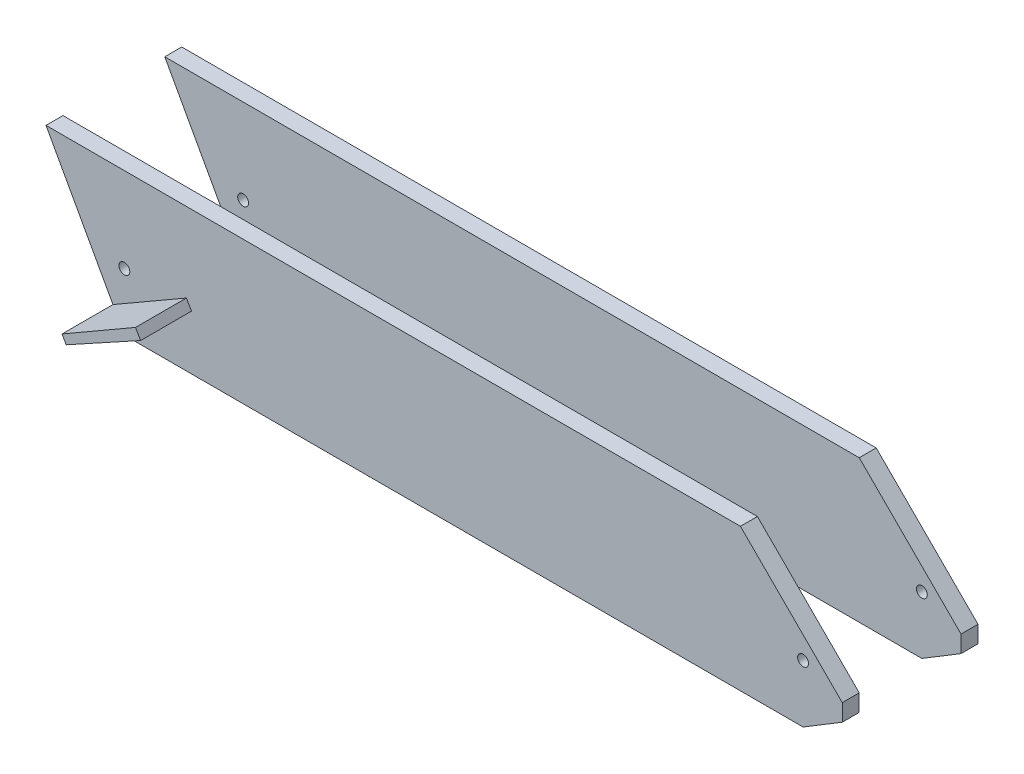
ISO-10303-21;
HEADER;
FILE_DESCRIPTION(('STEP AP214'),'2;1');
FILE_NAME('part.step','',(''),(''),'','','');
FILE_SCHEMA(('AUTOMOTIVE_DESIGN { 1 0 10303 214 1 1 1 1 }'));
ENDSEC;
DATA;
#1=APPLICATION_CONTEXT('core data for automotive mechanical design processes');
#2=APPLICATION_PROTOCOL_DEFINITION('international standard','automotive_design',2000,#1);
#3=PRODUCT_CONTEXT('',#1,'mechanical');
#4=PRODUCT('Part','Part','',(#3));
#5=PRODUCT_RELATED_PRODUCT_CATEGORY('part','',(#4));
#6=PRODUCT_DEFINITION_FORMATION('','',#4);
#7=PRODUCT_DEFINITION_CONTEXT('part definition',#1,'design');
#8=PRODUCT_DEFINITION('design','',#6,#7);
#9=PRODUCT_DEFINITION_SHAPE('','',#8);
#10=(LENGTH_UNIT() NAMED_UNIT(*) SI_UNIT(.MILLI.,.METRE.));
#11=(NAMED_UNIT(*) PLANE_ANGLE_UNIT() SI_UNIT($,.RADIAN.));
#12=(NAMED_UNIT(*) SI_UNIT($,.STERADIAN.) SOLID_ANGLE_UNIT());
#13=UNCERTAINTY_MEASURE_WITH_UNIT(LENGTH_MEASURE(1.E-05),#10,'distance_accuracy_value','');
#14=(GEOMETRIC_REPRESENTATION_CONTEXT(3) GLOBAL_UNCERTAINTY_ASSIGNED_CONTEXT((#13)) GLOBAL_UNIT_ASSIGNED_CONTEXT((#10,
#11,#12)) REPRESENTATION_CONTEXT('',''));
#15=CARTESIAN_POINT('',(0.,0.,0.));
#16=DIRECTION('',(0.,0.,1.));
#17=DIRECTION('',(1.,0.,0.));
#18=AXIS2_PLACEMENT_3D('',#15,#16,#17);
#19=CARTESIAN_POINT('',(0.,0.,40.));
#20=DIRECTION('',(0.,0.,1.));
#21=DIRECTION('',(1.,0.,0.));
#22=AXIS2_PLACEMENT_3D('',#19,#20,#21);
#23=PLANE('',#22);
#24=DIRECTION('',(0.,1.,0.));
#25=VECTOR('',#24,1.);
#26=CARTESIAN_POINT('',(211.546666666667,-85.,40.));
#27=LINE('',#26,#25);
#28=CARTESIAN_POINT('',(211.546666666667,-35.,40.));
#29=VERTEX_POINT('',#28);
#30=CARTESIAN_POINT('',(211.546666666667,-30.,40.));
#31=VERTEX_POINT('',#30);
#32=EDGE_CURVE('E190',#29,#31,#27,.T.);
#33=ORIENTED_EDGE('',*,*,#32,.T.);
#34=DIRECTION('',(-0.707106781186549,0.707106781186546,0.));
#35=VECTOR('',#34,1.);
#36=CARTESIAN_POINT('',(90.7733333333329,90.7733333333333,40.));
#37=LINE('',#36,#35);
#38=CARTESIAN_POINT('',(181.546666666667,0.,40.));
#39=VERTEX_POINT('',#38);
#40=EDGE_CURVE('E82',#31,#39,#37,.T.);
#41=ORIENTED_EDGE('',*,*,#40,.T.);
#42=DIRECTION('',(1.,0.,0.));
#43=VECTOR('',#42,1.);
#44=CARTESIAN_POINT('',(0.,0.,40.));
#45=LINE('',#44,#43);
#46=CARTESIAN_POINT('',(-23.09,0.,40.));
#47=VERTEX_POINT('',#46);
#48=EDGE_CURVE('E198',#47,#39,#45,.T.);
#49=ORIENTED_EDGE('',*,*,#48,.F.);
#50=DIRECTION('',(0.481758554533532,-0.87630399698607,0.));
#51=VECTOR('',#50,1.);
#52=CARTESIAN_POINT('',(-17.7310117706386,-9.747834804382,40.));
#53=LINE('',#52,#51);
#54=CARTESIAN_POINT('',(-3.36707241546777,-35.875398811189,40.));
#55=VERTEX_POINT('',#54);
#56=EDGE_CURVE('E167',#47,#55,#53,.T.);
#57=ORIENTED_EDGE('',*,*,#56,.T.);
#58=DIRECTION('',(0.866063003914026,0.499934869009368,0.));
#59=VECTOR('',#58,1.);
#60=CARTESIAN_POINT('',(14.6916053700843,-25.4510270594792,40.));
#61=LINE('',#60,#59);
#62=CARTESIAN_POINT('',(18.2845026823829,-23.3770270859548,40.));
#63=VERTEX_POINT('',#62);
#64=EDGE_CURVE('E163',#55,#63,#61,.T.);
#65=ORIENTED_EDGE('',*,*,#64,.T.);
#66=DIRECTION('',(0.499934869009367,-0.866063003914027,0.));
#67=VECTOR('',#66,1.);
#68=CARTESIAN_POINT('',(3.59289731229867,2.07399997352439,40.));
#69=LINE('',#68,#67);
#70=CARTESIAN_POINT('',(19.784307289411,-25.9752160976969,40.));
#71=VERTEX_POINT('',#70);
#72=EDGE_CURVE('E148',#63,#71,#69,.T.);
#73=ORIENTED_EDGE('',*,*,#72,.T.);
#74=DIRECTION('',(-0.87630399698607,-0.481758554533532,0.));
#75=VECTOR('',#74,1.);
#76=CARTESIAN_POINT('',(15.5576433702251,-28.298874904697,40.));
#77=LINE('',#76,#75);
#78=CARTESIAN_POINT('',(-2.1733684004135,-38.046709709079,40.));
#79=VERTEX_POINT('',#78);
#80=EDGE_CURVE('E136',#71,#79,#77,.T.);
#81=ORIENTED_EDGE('',*,*,#80,.T.);
#82=CARTESIAN_POINT('',(0.,-42.,40.));
#83=VERTEX_POINT('',#82);
#84=EDGE_CURVE('E147',#79,#83,#53,.T.);
#85=ORIENTED_EDGE('',*,*,#84,.T.);
#86=DIRECTION('',(-1.,0.,0.));
#87=VECTOR('',#86,1.);
#88=CARTESIAN_POINT('',(0.,-42.,40.));
#89=LINE('',#88,#87);
#90=CARTESIAN_POINT('',(200.,-42.,40.));
#91=VERTEX_POINT('',#90);
#92=EDGE_CURVE('E197',#91,#83,#89,.T.);
#93=ORIENTED_EDGE('',*,*,#92,.F.);
#94=DIRECTION('',(-0.855131508248987,-0.518411133753716,0.));
#95=VECTOR('',#94,1.);
#96=CARTESIAN_POINT('',(72.3690278973577,-119.374434588784,40.));
#97=LINE('',#96,#95);
#98=EDGE_CURVE('E203',#29,#91,#97,.T.);
#99=ORIENTED_EDGE('',*,*,#98,.F.);
#100=EDGE_LOOP('',(#33,#41,#49,#57,#65,#73,#81,#85,#93,#99));
#101=FACE_BOUND('',#100,.T.);
#102=CARTESIAN_POINT('',(0.,-25.,40.));
#103=DIRECTION('',(0.,0.,1.));
#104=DIRECTION('',(1.,0.,0.));
#105=AXIS2_PLACEMENT_3D('',#102,#103,#104);
#106=CIRCLE('',#105,1.6);
#107=CARTESIAN_POINT('',(1.6,-25.,40.));
#108=VERTEX_POINT('',#107);
#109=EDGE_CURVE('E184',#108,#108,#106,.T.);
#110=ORIENTED_EDGE('',*,*,#109,.F.);
#111=EDGE_LOOP('',(#110));
#112=FACE_BOUND('',#111,.T.);
#113=CARTESIAN_POINT('',(200.,-25.,40.));
#114=DIRECTION('',(0.,0.,1.));
#115=DIRECTION('',(1.,0.,0.));
#116=AXIS2_PLACEMENT_3D('',#113,#114,#115);
#117=CIRCLE('',#116,1.59999999999999);
#118=CARTESIAN_POINT('',(201.6,-25.,40.));
#119=VERTEX_POINT('',#118);
#120=EDGE_CURVE('E188',#119,#119,#117,.T.);
#121=ORIENTED_EDGE('',*,*,#120,.F.);
#122=EDGE_LOOP('',(#121));
#123=FACE_BOUND('',#122,.T.);
#124=ADVANCED_FACE('F58',(#101,#112,#123),#23,.T.);
#125=CARTESIAN_POINT('',(72.3690278973577,-119.374434588784,40.));
#126=DIRECTION('',(0.518411133753716,-0.855131508248987,0.));
#127=DIRECTION('',(0.855131508248987,0.518411133753716,0.));
#128=AXIS2_PLACEMENT_3D('',#125,#126,#127);
#129=PLANE('',#128);
#130=DIRECTION('',(0.855131508248987,0.518411133753716,0.));
#131=VECTOR('',#130,1.);
#132=CARTESIAN_POINT('',(50.9354840589545,-132.368211165183,35.));
#133=LINE('',#132,#131);
#134=CARTESIAN_POINT('',(200.,-42.,35.));
#135=VERTEX_POINT('',#134);
#136=CARTESIAN_POINT('',(211.546666666667,-35.,35.));
#137=VERTEX_POINT('',#136);
#138=EDGE_CURVE('E199',#135,#137,#133,.T.);
#139=ORIENTED_EDGE('',*,*,#138,.T.);
#140=DIRECTION('',(0.,0.,-1.));
#141=VECTOR('',#140,1.);
#142=CARTESIAN_POINT('',(211.546666666667,-35.,40.));
#143=LINE('',#142,#141);
#144=EDGE_CURVE('E174',#29,#137,#143,.T.);
#145=ORIENTED_EDGE('',*,*,#144,.F.);
#146=ORIENTED_EDGE('',*,*,#98,.T.);
#147=DIRECTION('',(0.,0.,-1.));
#148=VECTOR('',#147,1.);
#149=CARTESIAN_POINT('',(200.,-42.,40.));
#150=LINE('',#149,#148);
#151=EDGE_CURVE('E214',#91,#135,#150,.T.);
#152=ORIENTED_EDGE('',*,*,#151,.T.);
#153=EDGE_LOOP('',(#139,#145,#146,#152));
#154=FACE_BOUND('',#153,.T.);
#155=ADVANCED_FACE('F278',(#154),#129,.T.);
#156=CARTESIAN_POINT('',(-17.7310117706386,-9.747834804382,40.));
#157=DIRECTION('',(0.87630399698607,0.481758554533532,0.));
#158=DIRECTION('',(-0.481758554533532,0.87630399698607,0.));
#159=AXIS2_PLACEMENT_3D('',#156,#157,#158);
#160=PLANE('',#159);
#161=DIRECTION('',(0.481758554533532,-0.87630399698607,0.));
#162=VECTOR('',#161,1.);
#163=CARTESIAN_POINT('',(-17.7310117706386,-9.747834804382,35.));
#164=LINE('',#163,#162);
#165=CARTESIAN_POINT('',(-23.09,0.,35.));
#166=VERTEX_POINT('',#165);
#167=CARTESIAN_POINT('',(0.,-42.,35.));
#168=VERTEX_POINT('',#167);
#169=EDGE_CURVE('E218',#166,#168,#164,.T.);
#170=ORIENTED_EDGE('',*,*,#169,.T.);
#171=DIRECTION('',(0.,0.,-1.));
#172=VECTOR('',#171,1.);
#173=CARTESIAN_POINT('',(0.,-42.,40.));
#174=LINE('',#173,#172);
#175=EDGE_CURVE('E209',#83,#168,#174,.T.);
#176=ORIENTED_EDGE('',*,*,#175,.F.);
#177=ORIENTED_EDGE('',*,*,#84,.F.);
#178=DIRECTION('',(0.,0.,-1.));
#179=VECTOR('',#178,1.);
#180=CARTESIAN_POINT('',(-2.1733684004135,-38.046709709079,55.));
#181=LINE('',#180,#179);
#182=CARTESIAN_POINT('',(-2.1733684004135,-38.046709709079,55.));
#183=VERTEX_POINT('',#182);
#184=EDGE_CURVE('E143',#183,#79,#181,.T.);
#185=ORIENTED_EDGE('',*,*,#184,.F.);
#186=DIRECTION('',(0.481758554533532,-0.87630399698607,0.));
#187=VECTOR('',#186,1.);
#188=CARTESIAN_POINT('',(-17.7310117706386,-9.747834804382,55.));
#189=LINE('',#188,#187);
#190=CARTESIAN_POINT('',(-3.36707241546777,-35.875398811189,55.));
#191=VERTEX_POINT('',#190);
#192=EDGE_CURVE('E171',#191,#183,#189,.T.);
#193=ORIENTED_EDGE('',*,*,#192,.F.);
#194=DIRECTION('',(0.,0.,-1.));
#195=VECTOR('',#194,1.);
#196=CARTESIAN_POINT('',(-3.36707241546777,-35.875398811189,55.));
#197=LINE('',#196,#195);
#198=EDGE_CURVE('E208',#191,#55,#197,.T.);
#199=ORIENTED_EDGE('',*,*,#198,.T.);
#200=ORIENTED_EDGE('',*,*,#56,.F.);
#201=DIRECTION('',(0.,0.,-1.));
#202=VECTOR('',#201,1.);
#203=CARTESIAN_POINT('',(-23.09,0.,40.));
#204=LINE('',#203,#202);
#205=EDGE_CURVE('E204',#47,#166,#204,.T.);
#206=ORIENTED_EDGE('',*,*,#205,.T.);
#207=EDGE_LOOP('',(#170,#176,#177,#185,#193,#199,#200,#206));
#208=FACE_BOUND('',#207,.T.);
#209=ADVANCED_FACE('F264',(#208),#160,.F.);
#210=CARTESIAN_POINT('',(0.,0.,40.));
#211=DIRECTION('',(0.,1.,0.));
#212=DIRECTION('',(0.,0.,1.));
#213=AXIS2_PLACEMENT_3D('',#210,#211,#212);
#214=PLANE('',#213);
#215=ORIENTED_EDGE('',*,*,#48,.T.);
#216=DIRECTION('',(0.,0.,-1.));
#217=VECTOR('',#216,1.);
#218=CARTESIAN_POINT('',(181.546666666667,0.,35.));
#219=LINE('',#218,#217);
#220=CARTESIAN_POINT('',(181.546666666667,0.,35.));
#221=VERTEX_POINT('',#220);
#222=EDGE_CURVE('E68',#39,#221,#219,.T.);
#223=ORIENTED_EDGE('',*,*,#222,.T.);
#224=DIRECTION('',(1.,0.,0.));
#225=VECTOR('',#224,1.);
#226=CARTESIAN_POINT('',(0.,0.,35.));
#227=LINE('',#226,#225);
#228=EDGE_CURVE('E189',#166,#221,#227,.T.);
#229=ORIENTED_EDGE('',*,*,#228,.F.);
#230=ORIENTED_EDGE('',*,*,#205,.F.);
#231=EDGE_LOOP('',(#215,#223,#229,#230));
#232=FACE_BOUND('',#231,.T.);
#233=ADVANCED_FACE('F287',(#232),#214,.T.);
#234=CARTESIAN_POINT('',(0.,-42.,40.));
#235=DIRECTION('',(0.,-1.,0.));
#236=DIRECTION('',(1.,0.,0.));
#237=AXIS2_PLACEMENT_3D('',#234,#235,#236);
#238=PLANE('',#237);
#239=DIRECTION('',(1.,0.,0.));
#240=VECTOR('',#239,1.);
#241=CARTESIAN_POINT('',(-3.84833333333334,-42.,35.));
#242=LINE('',#241,#240);
#243=EDGE_CURVE('E193',#168,#135,#242,.T.);
#244=ORIENTED_EDGE('',*,*,#243,.T.);
#245=ORIENTED_EDGE('',*,*,#151,.F.);
#246=ORIENTED_EDGE('',*,*,#92,.T.);
#247=ORIENTED_EDGE('',*,*,#175,.T.);
#248=EDGE_LOOP('',(#244,#245,#246,#247));
#249=FACE_BOUND('',#248,.T.);
#250=ADVANCED_FACE('F274',(#249),#238,.T.);
#251=CARTESIAN_POINT('',(0.,-35.,35.));
#252=DIRECTION('',(0.,0.,1.));
#253=DIRECTION('',(1.,0.,0.));
#254=AXIS2_PLACEMENT_3D('',#251,#252,#253);
#255=PLANE('',#254);
#256=CARTESIAN_POINT('',(0.,-25.,35.));
#257=DIRECTION('',(0.,0.,1.));
#258=DIRECTION('',(1.,0.,0.));
#259=AXIS2_PLACEMENT_3D('',#256,#257,#258);
#260=CIRCLE('',#259,1.6);
#261=CARTESIAN_POINT('',(1.6,-25.,35.));
#262=VERTEX_POINT('',#261);
#263=EDGE_CURVE('E213',#262,#262,#260,.T.);
#264=ORIENTED_EDGE('',*,*,#263,.T.);
#265=EDGE_LOOP('',(#264));
#266=FACE_BOUND('',#265,.T.);
#267=CARTESIAN_POINT('',(200.,-25.,35.));
#268=DIRECTION('',(0.,0.,1.));
#269=DIRECTION('',(1.,0.,0.));
#270=AXIS2_PLACEMENT_3D('',#267,#268,#269);
#271=CIRCLE('',#270,1.59999999999999);
#272=CARTESIAN_POINT('',(201.6,-25.,35.));
#273=VERTEX_POINT('',#272);
#274=EDGE_CURVE('E239',#273,#273,#271,.T.);
#275=ORIENTED_EDGE('',*,*,#274,.T.);
#276=EDGE_LOOP('',(#275));
#277=FACE_BOUND('',#276,.T.);
#278=ORIENTED_EDGE('',*,*,#228,.T.);
#279=DIRECTION('',(0.707106781186549,-0.707106781186546,0.));
#280=VECTOR('',#279,1.);
#281=CARTESIAN_POINT('',(211.546666666667,-30.,35.));
#282=LINE('',#281,#280);
#283=CARTESIAN_POINT('',(211.546666666667,-30.,35.));
#284=VERTEX_POINT('',#283);
#285=EDGE_CURVE('E12',#221,#284,#282,.T.);
#286=ORIENTED_EDGE('',*,*,#285,.T.);
#287=DIRECTION('',(0.,-1.,0.));
#288=VECTOR('',#287,1.);
#289=CARTESIAN_POINT('',(211.546666666667,-35.,35.));
#290=LINE('',#289,#288);
#291=EDGE_CURVE('E185',#284,#137,#290,.T.);
#292=ORIENTED_EDGE('',*,*,#291,.T.);
#293=ORIENTED_EDGE('',*,*,#138,.F.);
#294=ORIENTED_EDGE('',*,*,#243,.F.);
#295=ORIENTED_EDGE('',*,*,#169,.F.);
#296=EDGE_LOOP('',(#278,#286,#292,#293,#294,#295));
#297=FACE_BOUND('',#296,.T.);
#298=ADVANCED_FACE('F286',(#266,#277,#297),#255,.F.);
#299=CARTESIAN_POINT('',(200.,-25.,-20.));
#300=DIRECTION('',(0.,0.,1.));
#301=DIRECTION('',(1.,0.,0.));
#302=AXIS2_PLACEMENT_3D('',#299,#300,#301);
#303=CYLINDRICAL_SURFACE('',#302,1.59999999999999);
#304=ORIENTED_EDGE('',*,*,#120,.T.);
#305=EDGE_LOOP('',(#304));
#306=FACE_BOUND('',#305,.T.);
#307=ORIENTED_EDGE('',*,*,#274,.F.);
#308=EDGE_LOOP('',(#307));
#309=FACE_BOUND('',#308,.T.);
#310=ADVANCED_FACE('F306',(#306,#309),#303,.F.);
#311=CARTESIAN_POINT('',(0.,-25.,-20.));
#312=DIRECTION('',(0.,0.,1.));
#313=DIRECTION('',(1.,0.,0.));
#314=AXIS2_PLACEMENT_3D('',#311,#312,#313);
#315=CYLINDRICAL_SURFACE('',#314,1.6);
#316=ORIENTED_EDGE('',*,*,#109,.T.);
#317=EDGE_LOOP('',(#316));
#318=FACE_BOUND('',#317,.T.);
#319=ORIENTED_EDGE('',*,*,#263,.F.);
#320=EDGE_LOOP('',(#319));
#321=FACE_BOUND('',#320,.T.);
#322=ADVANCED_FACE('F310',(#318,#321),#315,.F.);
#323=CARTESIAN_POINT('',(15.5576433702251,-28.298874904697,55.));
#324=DIRECTION('',(0.481758554533532,-0.87630399698607,0.));
#325=DIRECTION('',(0.87630399698607,0.481758554533532,0.));
#326=AXIS2_PLACEMENT_3D('',#323,#324,#325);
#327=PLANE('',#326);
#328=ORIENTED_EDGE('',*,*,#80,.F.);
#329=DIRECTION('',(0.,0.,-1.));
#330=VECTOR('',#329,1.);
#331=CARTESIAN_POINT('',(19.784307289411,-25.9752160976969,55.));
#332=LINE('',#331,#330);
#333=CARTESIAN_POINT('',(19.784307289411,-25.9752160976969,55.));
#334=VERTEX_POINT('',#333);
#335=EDGE_CURVE('E140',#334,#71,#332,.T.);
#336=ORIENTED_EDGE('',*,*,#335,.F.);
#337=DIRECTION('',(-0.87630399698607,-0.481758554533532,0.));
#338=VECTOR('',#337,1.);
#339=CARTESIAN_POINT('',(15.5576433702251,-28.298874904697,55.));
#340=LINE('',#339,#338);
#341=EDGE_CURVE('E181',#334,#183,#340,.T.);
#342=ORIENTED_EDGE('',*,*,#341,.T.);
#343=ORIENTED_EDGE('',*,*,#184,.T.);
#344=EDGE_LOOP('',(#328,#336,#342,#343));
#345=FACE_BOUND('',#344,.T.);
#346=ADVANCED_FACE('F138',(#345),#327,.T.);
#347=CARTESIAN_POINT('',(3.59289731229867,2.07399997352439,55.));
#348=DIRECTION('',(0.866063003914027,0.499934869009367,0.));
#349=DIRECTION('',(-0.499934869009367,0.866063003914027,0.));
#350=AXIS2_PLACEMENT_3D('',#347,#348,#349);
#351=PLANE('',#350);
#352=ORIENTED_EDGE('',*,*,#72,.F.);
#353=DIRECTION('',(0.,0.,-1.));
#354=VECTOR('',#353,1.);
#355=CARTESIAN_POINT('',(18.2845026823829,-23.3770270859548,55.));
#356=LINE('',#355,#354);
#357=CARTESIAN_POINT('',(18.2845026823829,-23.3770270859548,55.));
#358=VERTEX_POINT('',#357);
#359=EDGE_CURVE('E175',#358,#63,#356,.T.);
#360=ORIENTED_EDGE('',*,*,#359,.F.);
#361=DIRECTION('',(0.499934869009367,-0.866063003914027,0.));
#362=VECTOR('',#361,1.);
#363=CARTESIAN_POINT('',(3.59289731229867,2.07399997352439,55.));
#364=LINE('',#363,#362);
#365=EDGE_CURVE('E156',#358,#334,#364,.T.);
#366=ORIENTED_EDGE('',*,*,#365,.T.);
#367=ORIENTED_EDGE('',*,*,#335,.T.);
#368=EDGE_LOOP('',(#352,#360,#366,#367));
#369=FACE_BOUND('',#368,.T.);
#370=ADVANCED_FACE('F153',(#369),#351,.T.);
#371=CARTESIAN_POINT('',(14.6916053700843,-25.4510270594792,55.));
#372=DIRECTION('',(-0.499934869009368,0.866063003914026,0.));
#373=DIRECTION('',(-0.866063003914026,-0.499934869009368,0.));
#374=AXIS2_PLACEMENT_3D('',#371,#372,#373);
#375=PLANE('',#374);
#376=ORIENTED_EDGE('',*,*,#64,.F.);
#377=ORIENTED_EDGE('',*,*,#198,.F.);
#378=DIRECTION('',(0.866063003914026,0.499934869009368,0.));
#379=VECTOR('',#378,1.);
#380=CARTESIAN_POINT('',(14.6916053700843,-25.4510270594792,55.));
#381=LINE('',#380,#379);
#382=EDGE_CURVE('E158',#191,#358,#381,.T.);
#383=ORIENTED_EDGE('',*,*,#382,.T.);
#384=ORIENTED_EDGE('',*,*,#359,.T.);
#385=EDGE_LOOP('',(#376,#377,#383,#384));
#386=FACE_BOUND('',#385,.T.);
#387=ADVANCED_FACE('F268',(#386),#375,.T.);
#388=CARTESIAN_POINT('',(0.,0.,55.));
#389=DIRECTION('',(0.,0.,1.));
#390=DIRECTION('',(1.,0.,0.));
#391=AXIS2_PLACEMENT_3D('',#388,#389,#390);
#392=PLANE('',#391);
#393=ORIENTED_EDGE('',*,*,#341,.F.);
#394=ORIENTED_EDGE('',*,*,#365,.F.);
#395=ORIENTED_EDGE('',*,*,#382,.F.);
#396=ORIENTED_EDGE('',*,*,#192,.T.);
#397=EDGE_LOOP('',(#393,#394,#395,#396));
#398=FACE_BOUND('',#397,.T.);
#399=ADVANCED_FACE('F270',(#398),#392,.T.);
#400=CARTESIAN_POINT('',(211.546666666667,-85.,5.));
#401=DIRECTION('',(-1.,0.,0.));
#402=DIRECTION('',(0.,0.,1.));
#403=AXIS2_PLACEMENT_3D('',#400,#401,#402);
#404=PLANE('',#403);
#405=ORIENTED_EDGE('',*,*,#291,.F.);
#406=DIRECTION('',(0.,0.,1.));
#407=VECTOR('',#406,1.);
#408=CARTESIAN_POINT('',(211.546666666667,-30.,40.));
#409=LINE('',#408,#407);
#410=EDGE_CURVE('E222',#284,#31,#409,.T.);
#411=ORIENTED_EDGE('',*,*,#410,.T.);
#412=ORIENTED_EDGE('',*,*,#32,.F.);
#413=ORIENTED_EDGE('',*,*,#144,.T.);
#414=EDGE_LOOP('',(#405,#411,#412,#413));
#415=FACE_BOUND('',#414,.T.);
#416=ADVANCED_FACE('F281',(#415),#404,.F.);
#417=CARTESIAN_POINT('',(211.546666666667,-30.,5.));
#418=DIRECTION('',(0.707106781186546,0.707106781186549,0.));
#419=DIRECTION('',(0.,0.,-1.));
#420=AXIS2_PLACEMENT_3D('',#417,#418,#419);
#421=PLANE('',#420);
#422=ORIENTED_EDGE('',*,*,#285,.F.);
#423=ORIENTED_EDGE('',*,*,#222,.F.);
#424=ORIENTED_EDGE('',*,*,#40,.F.);
#425=ORIENTED_EDGE('',*,*,#410,.F.);
#426=EDGE_LOOP('',(#422,#423,#424,#425));
#427=FACE_BOUND('',#426,.T.);
#428=ADVANCED_FACE('F61',(#427),#421,.T.);
#429=CLOSED_SHELL('',(#124,#155,#209,#233,#250,#298,#310,#322,#346,#370,#387,#399,#416,#428));
#430=MANIFOLD_SOLID_BREP('B2',#429);
#431=CARTESIAN_POINT('',(0.,0.,0.));
#432=DIRECTION('',(0.,0.,1.));
#433=DIRECTION('',(1.,0.,0.));
#434=AXIS2_PLACEMENT_3D('',#431,#432,#433);
#435=PLANE('',#434);
#436=CARTESIAN_POINT('',(0.,-25.,0.));
#437=DIRECTION('',(0.,0.,1.));
#438=DIRECTION('',(1.,0.,0.));
#439=AXIS2_PLACEMENT_3D('',#436,#437,#438);
#440=CIRCLE('',#439,1.6);
#441=CARTESIAN_POINT('',(1.6,-25.,0.));
#442=VERTEX_POINT('',#441);
#443=EDGE_CURVE('E586',#442,#442,#440,.T.);
#444=ORIENTED_EDGE('',*,*,#443,.T.);
#445=EDGE_LOOP('',(#444));
#446=FACE_BOUND('',#445,.T.);
#447=CARTESIAN_POINT('',(200.,-25.,0.));
#448=DIRECTION('',(0.,0.,1.));
#449=DIRECTION('',(1.,0.,0.));
#450=AXIS2_PLACEMENT_3D('',#447,#448,#449);
#451=CIRCLE('',#450,1.59999999999999);
#452=CARTESIAN_POINT('',(201.6,-25.,0.));
#453=VERTEX_POINT('',#452);
#454=EDGE_CURVE('E580',#453,#453,#451,.T.);
#455=ORIENTED_EDGE('',*,*,#454,.T.);
#456=EDGE_LOOP('',(#455));
#457=FACE_BOUND('',#456,.T.);
#458=DIRECTION('',(1.,0.,0.));
#459=VECTOR('',#458,1.);
#460=CARTESIAN_POINT('',(0.,0.,0.));
#461=LINE('',#460,#459);
#462=CARTESIAN_POINT('',(-23.09,0.,0.));
#463=VERTEX_POINT('',#462);
#464=CARTESIAN_POINT('',(181.546666666667,0.,0.));
#465=VERTEX_POINT('',#464);
#466=EDGE_CURVE('E593',#463,#465,#461,.T.);
#467=ORIENTED_EDGE('',*,*,#466,.T.);
#468=DIRECTION('',(0.707106781186549,-0.707106781186546,0.));
#469=VECTOR('',#468,1.);
#470=CARTESIAN_POINT('',(211.546666666667,-30.,0.));
#471=LINE('',#470,#469);
#472=CARTESIAN_POINT('',(211.546666666667,-30.,0.));
#473=VERTEX_POINT('',#472);
#474=EDGE_CURVE('E56',#465,#473,#471,.T.);
#475=ORIENTED_EDGE('',*,*,#474,.T.);
#476=DIRECTION('',(0.,1.,0.));
#477=VECTOR('',#476,1.);
#478=CARTESIAN_POINT('',(211.546666666667,-85.,0.));
#479=LINE('',#478,#477);
#480=CARTESIAN_POINT('',(211.546666666667,-35.,0.));
#481=VERTEX_POINT('',#480);
#482=EDGE_CURVE('E548',#481,#473,#479,.T.);
#483=ORIENTED_EDGE('',*,*,#482,.F.);
#484=DIRECTION('',(-0.855131508248987,-0.518411133753716,0.));
#485=VECTOR('',#484,1.);
#486=CARTESIAN_POINT('',(72.3690278973577,-119.374434588784,0.));
#487=LINE('',#486,#485);
#488=CARTESIAN_POINT('',(200.,-42.,0.));
#489=VERTEX_POINT('',#488);
#490=EDGE_CURVE('E590',#481,#489,#487,.T.);
#491=ORIENTED_EDGE('',*,*,#490,.T.);
#492=DIRECTION('',(-1.,0.,0.));
#493=VECTOR('',#492,1.);
#494=CARTESIAN_POINT('',(0.,-42.,0.));
#495=LINE('',#494,#493);
#496=CARTESIAN_POINT('',(0.,-42.,0.));
#497=VERTEX_POINT('',#496);
#498=EDGE_CURVE('E557',#489,#497,#495,.T.);
#499=ORIENTED_EDGE('',*,*,#498,.T.);
#500=DIRECTION('',(0.481758554533532,-0.87630399698607,0.));
#501=VECTOR('',#500,1.);
#502=CARTESIAN_POINT('',(-17.7310117706386,-9.747834804382,0.));
#503=LINE('',#502,#501);
#504=EDGE_CURVE('E553',#463,#497,#503,.T.);
#505=ORIENTED_EDGE('',*,*,#504,.F.);
#506=EDGE_LOOP('',(#467,#475,#483,#491,#499,#505));
#507=FACE_BOUND('',#506,.T.);
#508=ADVANCED_FACE('F476',(#446,#457,#507),#435,.F.);
#509=CARTESIAN_POINT('',(200.,-25.,-20.));
#510=DIRECTION('',(0.,0.,1.));
#511=DIRECTION('',(1.,0.,0.));
#512=AXIS2_PLACEMENT_3D('',#509,#510,#511);
#513=CYLINDRICAL_SURFACE('',#512,1.59999999999999);
#514=CARTESIAN_POINT('',(200.,-25.,5.));
#515=DIRECTION('',(0.,0.,1.));
#516=DIRECTION('',(1.,0.,0.));
#517=AXIS2_PLACEMENT_3D('',#514,#515,#516);
#518=CIRCLE('',#517,1.59999999999999);
#519=CARTESIAN_POINT('',(201.6,-25.,5.));
#520=VERTEX_POINT('',#519);
#521=EDGE_CURVE('E574',#520,#520,#518,.T.);
#522=ORIENTED_EDGE('',*,*,#521,.T.);
#523=EDGE_LOOP('',(#522));
#524=FACE_BOUND('',#523,.T.);
#525=ORIENTED_EDGE('',*,*,#454,.F.);
#526=EDGE_LOOP('',(#525));
#527=FACE_BOUND('',#526,.T.);
#528=ADVANCED_FACE('F608',(#524,#527),#513,.F.);
#529=CARTESIAN_POINT('',(0.,-25.,-20.));
#530=DIRECTION('',(0.,0.,1.));
#531=DIRECTION('',(1.,0.,0.));
#532=AXIS2_PLACEMENT_3D('',#529,#530,#531);
#533=CYLINDRICAL_SURFACE('',#532,1.6);
#534=CARTESIAN_POINT('',(0.,-25.,5.));
#535=DIRECTION('',(0.,0.,1.));
#536=DIRECTION('',(1.,0.,0.));
#537=AXIS2_PLACEMENT_3D('',#534,#535,#536);
#538=CIRCLE('',#537,1.6);
#539=CARTESIAN_POINT('',(1.6,-25.,5.));
#540=VERTEX_POINT('',#539);
#541=EDGE_CURVE('E583',#540,#540,#538,.T.);
#542=ORIENTED_EDGE('',*,*,#541,.T.);
#543=EDGE_LOOP('',(#542));
#544=FACE_BOUND('',#543,.T.);
#545=ORIENTED_EDGE('',*,*,#443,.F.);
#546=EDGE_LOOP('',(#545));
#547=FACE_BOUND('',#546,.T.);
#548=ADVANCED_FACE('F614',(#544,#547),#533,.F.);
#549=CARTESIAN_POINT('',(0.,0.,40.));
#550=DIRECTION('',(0.,1.,0.));
#551=DIRECTION('',(0.,0.,1.));
#552=AXIS2_PLACEMENT_3D('',#549,#550,#551);
#553=PLANE('',#552);
#554=DIRECTION('',(1.,0.,0.));
#555=VECTOR('',#554,1.);
#556=CARTESIAN_POINT('',(0.,0.,5.));
#557=LINE('',#556,#555);
#558=CARTESIAN_POINT('',(-23.09,0.,5.));
#559=VERTEX_POINT('',#558);
#560=CARTESIAN_POINT('',(181.546666666667,0.,5.));
#561=VERTEX_POINT('',#560);
#562=EDGE_CURVE('E534',#559,#561,#557,.T.);
#563=ORIENTED_EDGE('',*,*,#562,.T.);
#564=DIRECTION('',(0.,0.,-1.));
#565=VECTOR('',#564,1.);
#566=CARTESIAN_POINT('',(181.546666666667,0.,0.));
#567=LINE('',#566,#565);
#568=EDGE_CURVE('E485',#561,#465,#567,.T.);
#569=ORIENTED_EDGE('',*,*,#568,.T.);
#570=ORIENTED_EDGE('',*,*,#466,.F.);
#571=DIRECTION('',(0.,0.,-1.));
#572=VECTOR('',#571,1.);
#573=CARTESIAN_POINT('',(-23.09,0.,40.));
#574=LINE('',#573,#572);
#575=EDGE_CURVE('E539',#559,#463,#574,.T.);
#576=ORIENTED_EDGE('',*,*,#575,.F.);
#577=EDGE_LOOP('',(#563,#569,#570,#576));
#578=FACE_BOUND('',#577,.T.);
#579=ADVANCED_FACE('F621',(#578),#553,.T.);
#580=CARTESIAN_POINT('',(211.546666666667,-85.,5.));
#581=DIRECTION('',(-1.,0.,0.));
#582=DIRECTION('',(0.,0.,1.));
#583=AXIS2_PLACEMENT_3D('',#580,#581,#582);
#584=PLANE('',#583);
#585=ORIENTED_EDGE('',*,*,#482,.T.);
#586=DIRECTION('',(0.,0.,1.));
#587=VECTOR('',#586,1.);
#588=CARTESIAN_POINT('',(211.546666666667,-30.,5.));
#589=LINE('',#588,#587);
#590=CARTESIAN_POINT('',(211.546666666667,-30.,5.));
#591=VERTEX_POINT('',#590);
#592=EDGE_CURVE('E538',#473,#591,#589,.T.);
#593=ORIENTED_EDGE('',*,*,#592,.T.);
#594=DIRECTION('',(0.,-1.,0.));
#595=VECTOR('',#594,1.);
#596=CARTESIAN_POINT('',(211.546666666667,-35.,5.));
#597=LINE('',#596,#595);
#598=CARTESIAN_POINT('',(211.546666666667,-35.,5.));
#599=VERTEX_POINT('',#598);
#600=EDGE_CURVE('E567',#591,#599,#597,.T.);
#601=ORIENTED_EDGE('',*,*,#600,.T.);
#602=DIRECTION('',(0.,0.,-1.));
#603=VECTOR('',#602,1.);
#604=CARTESIAN_POINT('',(211.546666666667,-35.,40.));
#605=LINE('',#604,#603);
#606=EDGE_CURVE('E572',#599,#481,#605,.T.);
#607=ORIENTED_EDGE('',*,*,#606,.T.);
#608=EDGE_LOOP('',(#585,#593,#601,#607));
#609=FACE_BOUND('',#608,.T.);
#610=ADVANCED_FACE('F566',(#609),#584,.F.);
#611=CARTESIAN_POINT('',(0.,-35.,5.));
#612=DIRECTION('',(0.,0.,1.));
#613=DIRECTION('',(1.,0.,0.));
#614=AXIS2_PLACEMENT_3D('',#611,#612,#613);
#615=PLANE('',#614);
#616=ORIENTED_EDGE('',*,*,#600,.F.);
#617=DIRECTION('',(-0.707106781186549,0.707106781186546,0.));
#618=VECTOR('',#617,1.);
#619=CARTESIAN_POINT('',(108.273333333333,73.2733333333333,5.));
#620=LINE('',#619,#618);
#621=EDGE_CURVE('E499',#591,#561,#620,.T.);
#622=ORIENTED_EDGE('',*,*,#621,.T.);
#623=ORIENTED_EDGE('',*,*,#562,.F.);
#624=DIRECTION('',(0.481758554533532,-0.87630399698607,0.));
#625=VECTOR('',#624,1.);
#626=CARTESIAN_POINT('',(-17.7310117706386,-9.747834804382,5.));
#627=LINE('',#626,#625);
#628=CARTESIAN_POINT('',(0.,-42.,5.));
#629=VERTEX_POINT('',#628);
#630=EDGE_CURVE('E527',#559,#629,#627,.T.);
#631=ORIENTED_EDGE('',*,*,#630,.T.);
#632=DIRECTION('',(-1.,0.,0.));
#633=VECTOR('',#632,1.);
#634=CARTESIAN_POINT('',(-3.84833333333334,-42.,5.));
#635=LINE('',#634,#633);
#636=CARTESIAN_POINT('',(200.,-42.,5.));
#637=VERTEX_POINT('',#636);
#638=EDGE_CURVE('E532',#637,#629,#635,.T.);
#639=ORIENTED_EDGE('',*,*,#638,.F.);
#640=DIRECTION('',(-0.855131508248987,-0.518411133753716,0.));
#641=VECTOR('',#640,1.);
#642=CARTESIAN_POINT('',(50.9354840589545,-132.368211165183,5.));
#643=LINE('',#642,#641);
#644=EDGE_CURVE('E549',#599,#637,#643,.T.);
#645=ORIENTED_EDGE('',*,*,#644,.F.);
#646=EDGE_LOOP('',(#616,#622,#623,#631,#639,#645));
#647=FACE_BOUND('',#646,.T.);
#648=ORIENTED_EDGE('',*,*,#541,.F.);
#649=EDGE_LOOP('',(#648));
#650=FACE_BOUND('',#649,.T.);
#651=ORIENTED_EDGE('',*,*,#521,.F.);
#652=EDGE_LOOP('',(#651));
#653=FACE_BOUND('',#652,.T.);
#654=ADVANCED_FACE('F529',(#647,#650,#653),#615,.T.);
#655=CARTESIAN_POINT('',(0.,-42.,40.));
#656=DIRECTION('',(0.,-1.,0.));
#657=DIRECTION('',(1.,0.,0.));
#658=AXIS2_PLACEMENT_3D('',#655,#656,#657);
#659=PLANE('',#658);
#660=ORIENTED_EDGE('',*,*,#638,.T.);
#661=DIRECTION('',(0.,0.,-1.));
#662=VECTOR('',#661,1.);
#663=CARTESIAN_POINT('',(0.,-42.,40.));
#664=LINE('',#663,#662);
#665=EDGE_CURVE('E545',#629,#497,#664,.T.);
#666=ORIENTED_EDGE('',*,*,#665,.T.);
#667=ORIENTED_EDGE('',*,*,#498,.F.);
#668=DIRECTION('',(0.,0.,-1.));
#669=VECTOR('',#668,1.);
#670=CARTESIAN_POINT('',(200.,-42.,40.));
#671=LINE('',#670,#669);
#672=EDGE_CURVE('E547',#637,#489,#671,.T.);
#673=ORIENTED_EDGE('',*,*,#672,.F.);
#674=EDGE_LOOP('',(#660,#666,#667,#673));
#675=FACE_BOUND('',#674,.T.);
#676=ADVANCED_FACE('F543',(#675),#659,.T.);
#677=CARTESIAN_POINT('',(-17.7310117706386,-9.747834804382,40.));
#678=DIRECTION('',(0.87630399698607,0.481758554533532,0.));
#679=DIRECTION('',(-0.481758554533532,0.87630399698607,0.));
#680=AXIS2_PLACEMENT_3D('',#677,#678,#679);
#681=PLANE('',#680);
#682=ORIENTED_EDGE('',*,*,#665,.F.);
#683=ORIENTED_EDGE('',*,*,#630,.F.);
#684=ORIENTED_EDGE('',*,*,#575,.T.);
#685=ORIENTED_EDGE('',*,*,#504,.T.);
#686=EDGE_LOOP('',(#682,#683,#684,#685));
#687=FACE_BOUND('',#686,.T.);
#688=ADVANCED_FACE('F551',(#687),#681,.F.);
#689=CARTESIAN_POINT('',(72.3690278973577,-119.374434588784,40.));
#690=DIRECTION('',(0.518411133753716,-0.855131508248987,0.));
#691=DIRECTION('',(0.855131508248987,0.518411133753716,0.));
#692=AXIS2_PLACEMENT_3D('',#689,#690,#691);
#693=PLANE('',#692);
#694=ORIENTED_EDGE('',*,*,#644,.T.);
#695=ORIENTED_EDGE('',*,*,#672,.T.);
#696=ORIENTED_EDGE('',*,*,#490,.F.);
#697=ORIENTED_EDGE('',*,*,#606,.F.);
#698=EDGE_LOOP('',(#694,#695,#696,#697));
#699=FACE_BOUND('',#698,.T.);
#700=ADVANCED_FACE('F598',(#699),#693,.T.);
#701=CARTESIAN_POINT('',(211.546666666667,-30.,5.));
#702=DIRECTION('',(0.707106781186546,0.707106781186549,0.));
#703=DIRECTION('',(0.,0.,-1.));
#704=AXIS2_PLACEMENT_3D('',#701,#702,#703);
#705=PLANE('',#704);
#706=ORIENTED_EDGE('',*,*,#474,.F.);
#707=ORIENTED_EDGE('',*,*,#568,.F.);
#708=ORIENTED_EDGE('',*,*,#621,.F.);
#709=ORIENTED_EDGE('',*,*,#592,.F.);
#710=EDGE_LOOP('',(#706,#707,#708,#709));
#711=FACE_BOUND('',#710,.T.);
#712=ADVANCED_FACE('F479',(#711),#705,.T.);
#713=CLOSED_SHELL('',(#508,#528,#548,#579,#610,#654,#676,#688,#700,#712));
#714=MANIFOLD_SOLID_BREP('B6',#713);
#715=ADVANCED_BREP_SHAPE_REPRESENTATION('',(#18,#430,#714),#14);
#716=SHAPE_DEFINITION_REPRESENTATION(#9,#715);
ENDSEC;
END-ISO-10303-21;
